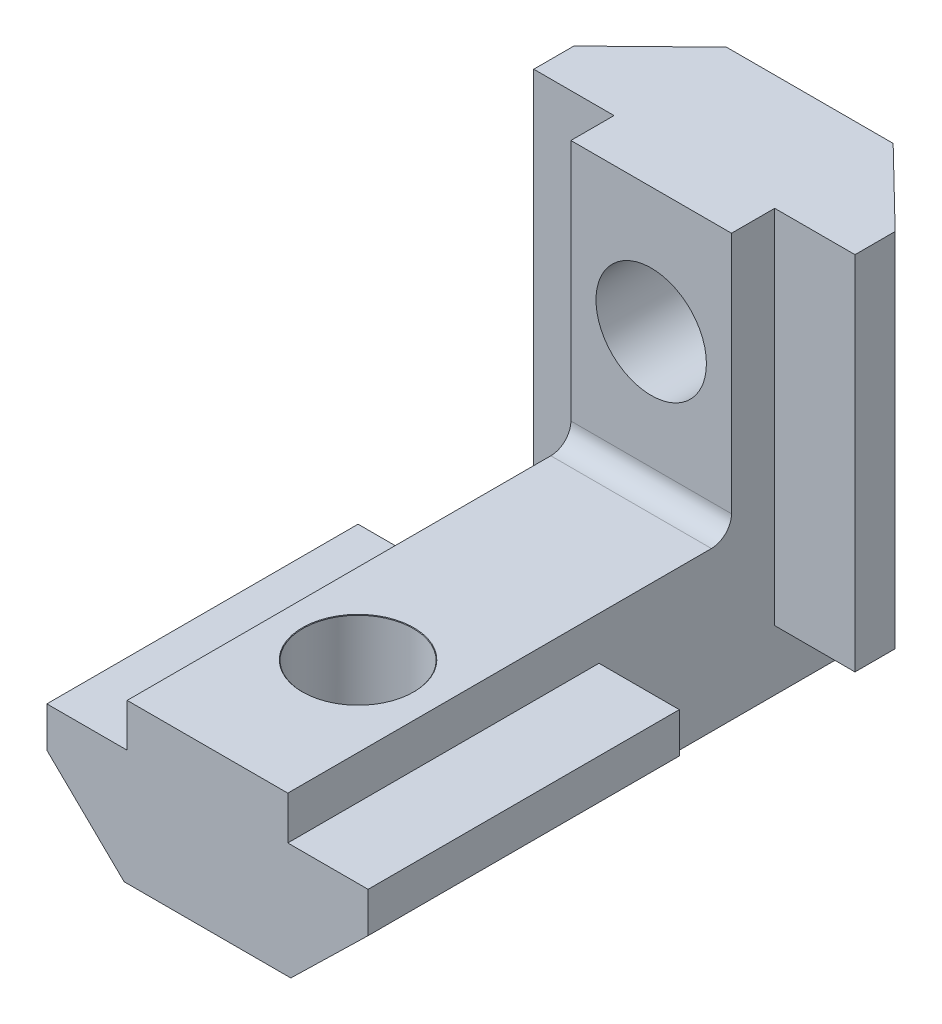
ISO-10303-21;
HEADER;
FILE_DESCRIPTION(('STEP AP214'),'2;1');
FILE_NAME('part.step','',(''),(''),'','','');
FILE_SCHEMA(('AUTOMOTIVE_DESIGN { 1 0 10303 214 1 1 1 1 }'));
ENDSEC;
DATA;
#1=APPLICATION_CONTEXT('core data for automotive mechanical design processes');
#2=APPLICATION_PROTOCOL_DEFINITION('international standard','automotive_design',2000,#1);
#3=PRODUCT_CONTEXT('',#1,'mechanical');
#4=PRODUCT('Part','Part','',(#3));
#5=PRODUCT_RELATED_PRODUCT_CATEGORY('part','',(#4));
#6=PRODUCT_DEFINITION_FORMATION('','',#4);
#7=PRODUCT_DEFINITION_CONTEXT('part definition',#1,'design');
#8=PRODUCT_DEFINITION('design','',#6,#7);
#9=PRODUCT_DEFINITION_SHAPE('','',#8);
#10=(LENGTH_UNIT() NAMED_UNIT(*) SI_UNIT(.MILLI.,.METRE.));
#11=(NAMED_UNIT(*) PLANE_ANGLE_UNIT() SI_UNIT($,.RADIAN.));
#12=(NAMED_UNIT(*) SI_UNIT($,.STERADIAN.) SOLID_ANGLE_UNIT());
#13=UNCERTAINTY_MEASURE_WITH_UNIT(LENGTH_MEASURE(1.E-05),#10,'distance_accuracy_value','');
#14=(GEOMETRIC_REPRESENTATION_CONTEXT(3) GLOBAL_UNCERTAINTY_ASSIGNED_CONTEXT((#13)) GLOBAL_UNIT_ASSIGNED_CONTEXT((#10,
#11,#12)) REPRESENTATION_CONTEXT('',''));
#15=CARTESIAN_POINT('',(0.,0.,0.));
#16=DIRECTION('',(0.,0.,1.));
#17=DIRECTION('',(1.,0.,0.));
#18=AXIS2_PLACEMENT_3D('',#15,#16,#17);
#19=CARTESIAN_POINT('',(-4.,7.9,-15.5));
#20=DIRECTION('',(-1.,0.,0.));
#21=DIRECTION('',(0.,0.,1.));
#22=AXIS2_PLACEMENT_3D('',#19,#20,#21);
#23=PLANE('',#22);
#24=DIRECTION('',(0.,0.,1.));
#25=VECTOR('',#24,1.);
#26=CARTESIAN_POINT('',(-4.,7.9,-15.5));
#27=LINE('',#26,#25);
#28=CARTESIAN_POINT('',(-4.,7.9,-21.1));
#29=VERTEX_POINT('',#28);
#30=CARTESIAN_POINT('',(-4.,7.9,0.));
#31=VERTEX_POINT('',#30);
#32=EDGE_CURVE('E306',#29,#31,#27,.T.);
#33=ORIENTED_EDGE('',*,*,#32,.F.);
#34=CARTESIAN_POINT('',(-4.,8.9,-21.1));
#35=DIRECTION('',(-1.,0.,0.));
#36=DIRECTION('',(0.,0.,1.));
#37=AXIS2_PLACEMENT_3D('',#34,#35,#36);
#38=CIRCLE('',#37,1.);
#39=CARTESIAN_POINT('',(-4.,8.9,-22.1));
#40=VERTEX_POINT('',#39);
#41=EDGE_CURVE('E44',#29,#40,#38,.F.);
#42=ORIENTED_EDGE('',*,*,#41,.T.);
#43=DIRECTION('',(0.,1.,0.));
#44=VECTOR('',#43,1.);
#45=CARTESIAN_POINT('',(-4.,-32.8440466262561,-22.1));
#46=LINE('',#45,#44);
#47=CARTESIAN_POINT('',(-4.,21.,-22.1));
#48=VERTEX_POINT('',#47);
#49=EDGE_CURVE('E248',#40,#48,#46,.T.);
#50=ORIENTED_EDGE('',*,*,#49,.T.);
#51=DIRECTION('',(0.,0.,-1.));
#52=VECTOR('',#51,1.);
#53=CARTESIAN_POINT('',(-4.,21.,-24.25));
#54=LINE('',#53,#52);
#55=CARTESIAN_POINT('',(-4.,21.,-24.25));
#56=VERTEX_POINT('',#55);
#57=EDGE_CURVE('E250',#48,#56,#54,.T.);
#58=ORIENTED_EDGE('',*,*,#57,.T.);
#59=DIRECTION('',(0.,1.,0.));
#60=VECTOR('',#59,1.);
#61=CARTESIAN_POINT('',(-4.,-32.8440466262561,-24.25));
#62=LINE('',#61,#60);
#63=CARTESIAN_POINT('',(-4.,3.,-24.25));
#64=VERTEX_POINT('',#63);
#65=EDGE_CURVE('E251',#64,#56,#62,.T.);
#66=ORIENTED_EDGE('',*,*,#65,.F.);
#67=DIRECTION('',(0.,0.,1.));
#68=VECTOR('',#67,1.);
#69=CARTESIAN_POINT('',(-4.,3.,-15.5));
#70=LINE('',#69,#68);
#71=CARTESIAN_POINT('',(-4.,3.,-30.));
#72=VERTEX_POINT('',#71);
#73=EDGE_CURVE('E219',#72,#64,#70,.T.);
#74=ORIENTED_EDGE('',*,*,#73,.F.);
#75=DIRECTION('',(0.,1.,0.));
#76=VECTOR('',#75,1.);
#77=CARTESIAN_POINT('',(-4.,0.,-30.));
#78=LINE('',#77,#76);
#79=CARTESIAN_POINT('',(-4.,0.,-30.));
#80=VERTEX_POINT('',#79);
#81=EDGE_CURVE('E206',#80,#72,#78,.T.);
#82=ORIENTED_EDGE('',*,*,#81,.F.);
#83=DIRECTION('',(0.,0.,1.));
#84=VECTOR('',#83,1.);
#85=CARTESIAN_POINT('',(-4.,0.,-30.));
#86=LINE('',#85,#84);
#87=CARTESIAN_POINT('',(-4.,0.,-15.5));
#88=VERTEX_POINT('',#87);
#89=EDGE_CURVE('E269',#80,#88,#86,.T.);
#90=ORIENTED_EDGE('',*,*,#89,.T.);
#91=DIRECTION('',(0.,1.,0.));
#92=VECTOR('',#91,1.);
#93=CARTESIAN_POINT('',(-4.,0.,-15.5));
#94=LINE('',#93,#92);
#95=CARTESIAN_POINT('',(-4.,5.75,-15.5));
#96=VERTEX_POINT('',#95);
#97=EDGE_CURVE('E263',#88,#96,#94,.T.);
#98=ORIENTED_EDGE('',*,*,#97,.T.);
#99=DIRECTION('',(0.,0.,1.));
#100=VECTOR('',#99,1.);
#101=CARTESIAN_POINT('',(-4.,5.75,-15.5));
#102=LINE('',#101,#100);
#103=CARTESIAN_POINT('',(-4.,5.75,0.));
#104=VERTEX_POINT('',#103);
#105=EDGE_CURVE('E303',#96,#104,#102,.T.);
#106=ORIENTED_EDGE('',*,*,#105,.T.);
#107=DIRECTION('',(0.,-1.,0.));
#108=VECTOR('',#107,1.);
#109=CARTESIAN_POINT('',(-4.,7.9,0.));
#110=LINE('',#109,#108);
#111=EDGE_CURVE('E329',#31,#104,#110,.T.);
#112=ORIENTED_EDGE('',*,*,#111,.F.);
#113=EDGE_LOOP('',(#33,#42,#50,#58,#66,#74,#82,#90,#98,#106,#112));
#114=FACE_BOUND('',#113,.T.);
#115=ADVANCED_FACE('F36',(#114),#23,.T.);
#116=CARTESIAN_POINT('',(4.,7.9,-15.5));
#117=DIRECTION('',(0.,1.,0.));
#118=DIRECTION('',(0.,0.,1.));
#119=AXIS2_PLACEMENT_3D('',#116,#117,#118);
#120=PLANE('',#119);
#121=CARTESIAN_POINT('',(0.,7.9,-7.5));
#122=DIRECTION('',(0.,1.,0.));
#123=DIRECTION('',(0.,0.,1.));
#124=AXIS2_PLACEMENT_3D('',#121,#122,#123);
#125=CIRCLE('',#124,2.775);
#126=CARTESIAN_POINT('',(0.,7.9,-4.725));
#127=VERTEX_POINT('',#126);
#128=EDGE_CURVE('E492',#127,#127,#125,.T.);
#129=ORIENTED_EDGE('',*,*,#128,.F.);
#130=EDGE_LOOP('',(#129));
#131=FACE_BOUND('',#130,.T.);
#132=DIRECTION('',(0.,0.,1.));
#133=VECTOR('',#132,1.);
#134=CARTESIAN_POINT('',(4.,7.9,-15.5));
#135=LINE('',#134,#133);
#136=CARTESIAN_POINT('',(4.,7.9,-21.1));
#137=VERTEX_POINT('',#136);
#138=CARTESIAN_POINT('',(4.,7.9,0.));
#139=VERTEX_POINT('',#138);
#140=EDGE_CURVE('E292',#137,#139,#135,.T.);
#141=ORIENTED_EDGE('',*,*,#140,.F.);
#142=DIRECTION('',(-1.,0.,0.));
#143=VECTOR('',#142,1.);
#144=CARTESIAN_POINT('',(4.,7.9,-21.1));
#145=LINE('',#144,#143);
#146=EDGE_CURVE('E279',#137,#29,#145,.T.);
#147=ORIENTED_EDGE('',*,*,#146,.T.);
#148=ORIENTED_EDGE('',*,*,#32,.T.);
#149=DIRECTION('',(-1.,0.,0.));
#150=VECTOR('',#149,1.);
#151=CARTESIAN_POINT('',(4.,7.9,0.));
#152=LINE('',#151,#150);
#153=EDGE_CURVE('E373',#139,#31,#152,.T.);
#154=ORIENTED_EDGE('',*,*,#153,.F.);
#155=EDGE_LOOP('',(#141,#147,#148,#154));
#156=FACE_BOUND('',#155,.T.);
#157=ADVANCED_FACE('F323',(#131,#156),#120,.T.);
#158=CARTESIAN_POINT('',(4.,5.75,-15.5));
#159=DIRECTION('',(1.,0.,0.));
#160=DIRECTION('',(0.,0.,-1.));
#161=AXIS2_PLACEMENT_3D('',#158,#159,#160);
#162=PLANE('',#161);
#163=DIRECTION('',(0.,1.,0.));
#164=VECTOR('',#163,1.);
#165=CARTESIAN_POINT('',(4.,-32.8440466262561,-24.25));
#166=LINE('',#165,#164);
#167=CARTESIAN_POINT('',(4.,3.,-24.25));
#168=VERTEX_POINT('',#167);
#169=CARTESIAN_POINT('',(4.,21.,-24.25));
#170=VERTEX_POINT('',#169);
#171=EDGE_CURVE('E242',#168,#170,#166,.T.);
#172=ORIENTED_EDGE('',*,*,#171,.T.);
#173=DIRECTION('',(0.,0.,1.));
#174=VECTOR('',#173,1.);
#175=CARTESIAN_POINT('',(4.,21.,-22.1));
#176=LINE('',#175,#174);
#177=CARTESIAN_POINT('',(4.,21.,-22.1));
#178=VERTEX_POINT('',#177);
#179=EDGE_CURVE('E244',#170,#178,#176,.T.);
#180=ORIENTED_EDGE('',*,*,#179,.T.);
#181=DIRECTION('',(0.,1.,0.));
#182=VECTOR('',#181,1.);
#183=CARTESIAN_POINT('',(4.,-32.8440466262561,-22.1));
#184=LINE('',#183,#182);
#185=CARTESIAN_POINT('',(4.,8.9,-22.1));
#186=VERTEX_POINT('',#185);
#187=EDGE_CURVE('E245',#186,#178,#184,.T.);
#188=ORIENTED_EDGE('',*,*,#187,.F.);
#189=CARTESIAN_POINT('',(4.,8.9,-21.1));
#190=DIRECTION('',(1.,0.,0.));
#191=DIRECTION('',(0.,0.,-1.));
#192=AXIS2_PLACEMENT_3D('',#189,#190,#191);
#193=CIRCLE('',#192,1.);
#194=EDGE_CURVE('E12',#186,#137,#193,.F.);
#195=ORIENTED_EDGE('',*,*,#194,.T.);
#196=ORIENTED_EDGE('',*,*,#140,.T.);
#197=DIRECTION('',(0.,1.,0.));
#198=VECTOR('',#197,1.);
#199=CARTESIAN_POINT('',(4.,5.75,0.));
#200=LINE('',#199,#198);
#201=CARTESIAN_POINT('',(4.,5.75,0.));
#202=VERTEX_POINT('',#201);
#203=EDGE_CURVE('E370',#202,#139,#200,.T.);
#204=ORIENTED_EDGE('',*,*,#203,.F.);
#205=DIRECTION('',(0.,0.,1.));
#206=VECTOR('',#205,1.);
#207=CARTESIAN_POINT('',(4.,5.75,-15.5));
#208=LINE('',#207,#206);
#209=CARTESIAN_POINT('',(4.,5.75,-15.5));
#210=VERTEX_POINT('',#209);
#211=EDGE_CURVE('E290',#210,#202,#208,.T.);
#212=ORIENTED_EDGE('',*,*,#211,.F.);
#213=DIRECTION('',(0.,-1.,0.));
#214=VECTOR('',#213,1.);
#215=CARTESIAN_POINT('',(4.,7.9,-15.5));
#216=LINE('',#215,#214);
#217=CARTESIAN_POINT('',(4.,0.,-15.5));
#218=VERTEX_POINT('',#217);
#219=EDGE_CURVE('E275',#210,#218,#216,.T.);
#220=ORIENTED_EDGE('',*,*,#219,.T.);
#221=DIRECTION('',(0.,0.,1.));
#222=VECTOR('',#221,1.);
#223=CARTESIAN_POINT('',(4.,0.,-30.));
#224=LINE('',#223,#222);
#225=CARTESIAN_POINT('',(4.,0.,-30.));
#226=VERTEX_POINT('',#225);
#227=EDGE_CURVE('E284',#226,#218,#224,.T.);
#228=ORIENTED_EDGE('',*,*,#227,.F.);
#229=DIRECTION('',(0.,-1.,0.));
#230=VECTOR('',#229,1.);
#231=CARTESIAN_POINT('',(4.,7.9,-30.));
#232=LINE('',#231,#230);
#233=CARTESIAN_POINT('',(4.,3.,-30.));
#234=VERTEX_POINT('',#233);
#235=EDGE_CURVE('E264',#234,#226,#232,.T.);
#236=ORIENTED_EDGE('',*,*,#235,.F.);
#237=DIRECTION('',(0.,0.,-1.));
#238=VECTOR('',#237,1.);
#239=CARTESIAN_POINT('',(4.,3.,-15.5));
#240=LINE('',#239,#238);
#241=EDGE_CURVE('E216',#168,#234,#240,.T.);
#242=ORIENTED_EDGE('',*,*,#241,.F.);
#243=EDGE_LOOP('',(#172,#180,#188,#195,#196,#204,#212,#220,#228,#236,#242));
#244=FACE_BOUND('',#243,.T.);
#245=ADVANCED_FACE('F409',(#244),#162,.T.);
#246=CARTESIAN_POINT('',(0.,0.,-15.5));
#247=DIRECTION('',(0.,0.,-1.));
#248=DIRECTION('',(-1.,0.,0.));
#249=AXIS2_PLACEMENT_3D('',#246,#247,#248);
#250=PLANE('',#249);
#251=ORIENTED_EDGE('',*,*,#97,.F.);
#252=DIRECTION('',(1.,0.,0.));
#253=VECTOR('',#252,1.);
#254=CARTESIAN_POINT('',(-4.15,0.,-15.5));
#255=LINE('',#254,#253);
#256=CARTESIAN_POINT('',(-4.15,0.,-15.5));
#257=VERTEX_POINT('',#256);
#258=EDGE_CURVE('E342',#257,#88,#255,.T.);
#259=ORIENTED_EDGE('',*,*,#258,.F.);
#260=DIRECTION('',(0.7163488096607,-0.697742347072111,0.));
#261=VECTOR('',#260,1.);
#262=CARTESIAN_POINT('',(-4.15,0.,-15.5));
#263=LINE('',#262,#261);
#264=CARTESIAN_POINT('',(-8.,3.75,-15.5));
#265=VERTEX_POINT('',#264);
#266=EDGE_CURVE('E348',#265,#257,#263,.T.);
#267=ORIENTED_EDGE('',*,*,#266,.F.);
#268=DIRECTION('',(0.,-1.,0.));
#269=VECTOR('',#268,1.);
#270=CARTESIAN_POINT('',(-8.,3.75,-15.5));
#271=LINE('',#270,#269);
#272=CARTESIAN_POINT('',(-8.,5.75,-15.5));
#273=VERTEX_POINT('',#272);
#274=EDGE_CURVE('E311',#273,#265,#271,.T.);
#275=ORIENTED_EDGE('',*,*,#274,.F.);
#276=DIRECTION('',(-1.,0.,0.));
#277=VECTOR('',#276,1.);
#278=CARTESIAN_POINT('',(-4.,5.75,-15.5));
#279=LINE('',#278,#277);
#280=EDGE_CURVE('E299',#96,#273,#279,.T.);
#281=ORIENTED_EDGE('',*,*,#280,.F.);
#282=EDGE_LOOP('',(#251,#259,#267,#275,#281));
#283=FACE_BOUND('',#282,.T.);
#284=ADVANCED_FACE('F401',(#283),#250,.T.);
#285=CARTESIAN_POINT('',(-4.15,0.,-15.5));
#286=DIRECTION('',(-0.697742347072111,-0.7163488096607,0.));
#287=DIRECTION('',(0.7163488096607,-0.697742347072111,0.));
#288=AXIS2_PLACEMENT_3D('',#285,#286,#287);
#289=PLANE('',#288);
#290=DIRECTION('',(0.7163488096607,-0.697742347072111,0.));
#291=VECTOR('',#290,1.);
#292=CARTESIAN_POINT('',(-4.15,0.,0.));
#293=LINE('',#292,#291);
#294=CARTESIAN_POINT('',(-8.,3.75,0.));
#295=VERTEX_POINT('',#294);
#296=CARTESIAN_POINT('',(-4.15,0.,0.));
#297=VERTEX_POINT('',#296);
#298=EDGE_CURVE('E287',#295,#297,#293,.T.);
#299=ORIENTED_EDGE('',*,*,#298,.F.);
#300=DIRECTION('',(0.,0.,1.));
#301=VECTOR('',#300,1.);
#302=CARTESIAN_POINT('',(-8.,3.75,-15.5));
#303=LINE('',#302,#301);
#304=EDGE_CURVE('E280',#265,#295,#303,.T.);
#305=ORIENTED_EDGE('',*,*,#304,.F.);
#306=ORIENTED_EDGE('',*,*,#266,.T.);
#307=DIRECTION('',(0.,0.,1.));
#308=VECTOR('',#307,1.);
#309=CARTESIAN_POINT('',(-4.15,0.,-15.5));
#310=LINE('',#309,#308);
#311=EDGE_CURVE('E341',#257,#297,#310,.T.);
#312=ORIENTED_EDGE('',*,*,#311,.T.);
#313=EDGE_LOOP('',(#299,#305,#306,#312));
#314=FACE_BOUND('',#313,.T.);
#315=ADVANCED_FACE('F393',(#314),#289,.T.);
#316=CARTESIAN_POINT('',(-8.,3.75,-15.5));
#317=DIRECTION('',(-1.,0.,0.));
#318=DIRECTION('',(0.,0.,1.));
#319=AXIS2_PLACEMENT_3D('',#316,#317,#318);
#320=PLANE('',#319);
#321=DIRECTION('',(0.,-1.,0.));
#322=VECTOR('',#321,1.);
#323=CARTESIAN_POINT('',(-8.,3.75,0.));
#324=LINE('',#323,#322);
#325=CARTESIAN_POINT('',(-8.,5.75,0.));
#326=VERTEX_POINT('',#325);
#327=EDGE_CURVE('E379',#326,#295,#324,.T.);
#328=ORIENTED_EDGE('',*,*,#327,.F.);
#329=DIRECTION('',(0.,0.,1.));
#330=VECTOR('',#329,1.);
#331=CARTESIAN_POINT('',(-8.,5.75,-15.5));
#332=LINE('',#331,#330);
#333=EDGE_CURVE('E305',#273,#326,#332,.T.);
#334=ORIENTED_EDGE('',*,*,#333,.F.);
#335=ORIENTED_EDGE('',*,*,#274,.T.);
#336=ORIENTED_EDGE('',*,*,#304,.T.);
#337=EDGE_LOOP('',(#328,#334,#335,#336));
#338=FACE_BOUND('',#337,.T.);
#339=ADVANCED_FACE('F391',(#338),#320,.T.);
#340=CARTESIAN_POINT('',(-4.,5.75,-15.5));
#341=DIRECTION('',(0.,1.,0.));
#342=DIRECTION('',(0.,0.,1.));
#343=AXIS2_PLACEMENT_3D('',#340,#341,#342);
#344=PLANE('',#343);
#345=DIRECTION('',(-1.,0.,0.));
#346=VECTOR('',#345,1.);
#347=CARTESIAN_POINT('',(-4.,5.75,0.));
#348=LINE('',#347,#346);
#349=EDGE_CURVE('E376',#104,#326,#348,.T.);
#350=ORIENTED_EDGE('',*,*,#349,.F.);
#351=ORIENTED_EDGE('',*,*,#105,.F.);
#352=ORIENTED_EDGE('',*,*,#280,.T.);
#353=ORIENTED_EDGE('',*,*,#333,.T.);
#354=EDGE_LOOP('',(#350,#351,#352,#353));
#355=FACE_BOUND('',#354,.T.);
#356=ADVANCED_FACE('F386',(#355),#344,.T.);
#357=CARTESIAN_POINT('',(8.,5.75,-15.5));
#358=DIRECTION('',(0.,1.,0.));
#359=DIRECTION('',(0.,0.,1.));
#360=AXIS2_PLACEMENT_3D('',#357,#358,#359);
#361=PLANE('',#360);
#362=DIRECTION('',(-1.,0.,0.));
#363=VECTOR('',#362,1.);
#364=CARTESIAN_POINT('',(8.,5.75,0.));
#365=LINE('',#364,#363);
#366=CARTESIAN_POINT('',(8.,5.75,0.));
#367=VERTEX_POINT('',#366);
#368=EDGE_CURVE('E367',#367,#202,#365,.T.);
#369=ORIENTED_EDGE('',*,*,#368,.F.);
#370=DIRECTION('',(0.,0.,1.));
#371=VECTOR('',#370,1.);
#372=CARTESIAN_POINT('',(8.,5.75,-15.5));
#373=LINE('',#372,#371);
#374=CARTESIAN_POINT('',(8.,5.75,-15.5));
#375=VERTEX_POINT('',#374);
#376=EDGE_CURVE('E293',#375,#367,#373,.T.);
#377=ORIENTED_EDGE('',*,*,#376,.F.);
#378=DIRECTION('',(-1.,0.,0.));
#379=VECTOR('',#378,1.);
#380=CARTESIAN_POINT('',(8.,5.75,-15.5));
#381=LINE('',#380,#379);
#382=EDGE_CURVE('E296',#375,#210,#381,.T.);
#383=ORIENTED_EDGE('',*,*,#382,.T.);
#384=ORIENTED_EDGE('',*,*,#211,.T.);
#385=EDGE_LOOP('',(#369,#377,#383,#384));
#386=FACE_BOUND('',#385,.T.);
#387=ADVANCED_FACE('F399',(#386),#361,.T.);
#388=CARTESIAN_POINT('',(8.,3.75,-15.5));
#389=DIRECTION('',(1.,0.,0.));
#390=DIRECTION('',(0.,0.,-1.));
#391=AXIS2_PLACEMENT_3D('',#388,#389,#390);
#392=PLANE('',#391);
#393=DIRECTION('',(0.,1.,0.));
#394=VECTOR('',#393,1.);
#395=CARTESIAN_POINT('',(8.,3.75,0.));
#396=LINE('',#395,#394);
#397=CARTESIAN_POINT('',(8.,3.75,0.));
#398=VERTEX_POINT('',#397);
#399=EDGE_CURVE('E364',#398,#367,#396,.T.);
#400=ORIENTED_EDGE('',*,*,#399,.F.);
#401=DIRECTION('',(0.,0.,1.));
#402=VECTOR('',#401,1.);
#403=CARTESIAN_POINT('',(8.,3.75,-15.5));
#404=LINE('',#403,#402);
#405=CARTESIAN_POINT('',(8.,3.75,-15.5));
#406=VERTEX_POINT('',#405);
#407=EDGE_CURVE('E337',#406,#398,#404,.T.);
#408=ORIENTED_EDGE('',*,*,#407,.F.);
#409=DIRECTION('',(0.,1.,0.));
#410=VECTOR('',#409,1.);
#411=CARTESIAN_POINT('',(8.,3.75,-15.5));
#412=LINE('',#411,#410);
#413=EDGE_CURVE('E300',#406,#375,#412,.T.);
#414=ORIENTED_EDGE('',*,*,#413,.T.);
#415=ORIENTED_EDGE('',*,*,#376,.T.);
#416=EDGE_LOOP('',(#400,#408,#414,#415));
#417=FACE_BOUND('',#416,.T.);
#418=ADVANCED_FACE('F418',(#417),#392,.T.);
#419=CARTESIAN_POINT('',(4.15,0.,-15.5));
#420=DIRECTION('',(0.697742347072111,-0.7163488096607,0.));
#421=DIRECTION('',(0.7163488096607,0.697742347072111,0.));
#422=AXIS2_PLACEMENT_3D('',#419,#420,#421);
#423=PLANE('',#422);
#424=DIRECTION('',(0.7163488096607,0.697742347072111,0.));
#425=VECTOR('',#424,1.);
#426=CARTESIAN_POINT('',(4.15,0.,0.));
#427=LINE('',#426,#425);
#428=CARTESIAN_POINT('',(4.15,0.,0.));
#429=VERTEX_POINT('',#428);
#430=EDGE_CURVE('E361',#429,#398,#427,.T.);
#431=ORIENTED_EDGE('',*,*,#430,.F.);
#432=DIRECTION('',(0.,0.,1.));
#433=VECTOR('',#432,1.);
#434=CARTESIAN_POINT('',(4.15,0.,-15.5));
#435=LINE('',#434,#433);
#436=CARTESIAN_POINT('',(4.15,0.,-15.5));
#437=VERTEX_POINT('',#436);
#438=EDGE_CURVE('E339',#437,#429,#435,.T.);
#439=ORIENTED_EDGE('',*,*,#438,.F.);
#440=DIRECTION('',(0.7163488096607,0.697742347072111,0.));
#441=VECTOR('',#440,1.);
#442=CARTESIAN_POINT('',(4.15,0.,-15.5));
#443=LINE('',#442,#441);
#444=EDGE_CURVE('E344',#437,#406,#443,.T.);
#445=ORIENTED_EDGE('',*,*,#444,.T.);
#446=ORIENTED_EDGE('',*,*,#407,.T.);
#447=EDGE_LOOP('',(#431,#439,#445,#446));
#448=FACE_BOUND('',#447,.T.);
#449=ADVANCED_FACE('F422',(#448),#423,.T.);
#450=CARTESIAN_POINT('',(-4.15,0.,-15.5));
#451=DIRECTION('',(0.,-1.,0.));
#452=DIRECTION('',(0.,0.,-1.));
#453=AXIS2_PLACEMENT_3D('',#450,#451,#452);
#454=PLANE('',#453);
#455=CARTESIAN_POINT('',(0.,0.,-7.5));
#456=DIRECTION('',(0.,-1.,0.));
#457=DIRECTION('',(0.,0.,-1.));
#458=AXIS2_PLACEMENT_3D('',#455,#456,#457);
#459=CIRCLE('',#458,2.75);
#460=CARTESIAN_POINT('',(0.,0.,-10.25));
#461=VERTEX_POINT('',#460);
#462=EDGE_CURVE('E260',#461,#461,#459,.T.);
#463=ORIENTED_EDGE('',*,*,#462,.F.);
#464=EDGE_LOOP('',(#463));
#465=FACE_BOUND('',#464,.T.);
#466=DIRECTION('',(1.,0.,0.));
#467=VECTOR('',#466,1.);
#468=CARTESIAN_POINT('',(-4.15,0.,0.));
#469=LINE('',#468,#467);
#470=EDGE_CURVE('E358',#297,#429,#469,.T.);
#471=ORIENTED_EDGE('',*,*,#470,.F.);
#472=ORIENTED_EDGE('',*,*,#311,.F.);
#473=ORIENTED_EDGE('',*,*,#258,.T.);
#474=ORIENTED_EDGE('',*,*,#89,.F.);
#475=DIRECTION('',(-1.,0.,0.));
#476=VECTOR('',#475,1.);
#477=CARTESIAN_POINT('',(4.,0.,-30.));
#478=LINE('',#477,#476);
#479=EDGE_CURVE('E266',#226,#80,#478,.T.);
#480=ORIENTED_EDGE('',*,*,#479,.F.);
#481=ORIENTED_EDGE('',*,*,#227,.T.);
#482=EDGE_CURVE('E281',#218,#437,#255,.T.);
#483=ORIENTED_EDGE('',*,*,#482,.T.);
#484=ORIENTED_EDGE('',*,*,#438,.T.);
#485=EDGE_LOOP('',(#471,#472,#473,#474,#480,#481,#483,#484));
#486=FACE_BOUND('',#485,.T.);
#487=ADVANCED_FACE('F426',(#465,#486),#454,.T.);
#488=ORIENTED_EDGE('',*,*,#219,.F.);
#489=ORIENTED_EDGE('',*,*,#382,.F.);
#490=ORIENTED_EDGE('',*,*,#413,.F.);
#491=ORIENTED_EDGE('',*,*,#444,.F.);
#492=ORIENTED_EDGE('',*,*,#482,.F.);
#493=EDGE_LOOP('',(#488,#489,#490,#491,#492));
#494=FACE_BOUND('',#493,.T.);
#495=ADVANCED_FACE('F429',(#494),#250,.T.);
#496=CARTESIAN_POINT('',(0.,0.,0.));
#497=DIRECTION('',(0.,0.,-1.));
#498=DIRECTION('',(-1.,0.,0.));
#499=AXIS2_PLACEMENT_3D('',#496,#497,#498);
#500=PLANE('',#499);
#501=ORIENTED_EDGE('',*,*,#298,.T.);
#502=ORIENTED_EDGE('',*,*,#470,.T.);
#503=ORIENTED_EDGE('',*,*,#430,.T.);
#504=ORIENTED_EDGE('',*,*,#399,.T.);
#505=ORIENTED_EDGE('',*,*,#368,.T.);
#506=ORIENTED_EDGE('',*,*,#203,.T.);
#507=ORIENTED_EDGE('',*,*,#153,.T.);
#508=ORIENTED_EDGE('',*,*,#111,.T.);
#509=ORIENTED_EDGE('',*,*,#349,.T.);
#510=ORIENTED_EDGE('',*,*,#327,.T.);
#511=EDGE_LOOP('',(#501,#502,#503,#504,#505,#506,#507,#508,#509,#510));
#512=FACE_BOUND('',#511,.T.);
#513=ADVANCED_FACE('F390',(#512),#500,.F.);
#514=CARTESIAN_POINT('',(0.,0.,-30.));
#515=DIRECTION('',(0.,0.,-1.));
#516=DIRECTION('',(-1.,0.,0.));
#517=AXIS2_PLACEMENT_3D('',#514,#515,#516);
#518=PLANE('',#517);
#519=CARTESIAN_POINT('',(0.,14.75,-30.));
#520=DIRECTION('',(0.,0.,-1.));
#521=DIRECTION('',(-1.,0.,0.));
#522=AXIS2_PLACEMENT_3D('',#519,#520,#521);
#523=CIRCLE('',#522,2.75);
#524=CARTESIAN_POINT('',(-2.75,14.75,-30.));
#525=VERTEX_POINT('',#524);
#526=EDGE_CURVE('E490',#525,#525,#523,.T.);
#527=ORIENTED_EDGE('',*,*,#526,.F.);
#528=EDGE_LOOP('',(#527));
#529=FACE_BOUND('',#528,.T.);
#530=ORIENTED_EDGE('',*,*,#81,.T.);
#531=DIRECTION('',(1.,0.,0.));
#532=VECTOR('',#531,1.);
#533=CARTESIAN_POINT('',(4.15,3.,-30.));
#534=LINE('',#533,#532);
#535=CARTESIAN_POINT('',(-4.15,3.,-30.));
#536=VERTEX_POINT('',#535);
#537=EDGE_CURVE('E203',#536,#72,#534,.T.);
#538=ORIENTED_EDGE('',*,*,#537,.F.);
#539=DIRECTION('',(0.,1.,0.));
#540=VECTOR('',#539,1.);
#541=CARTESIAN_POINT('',(-4.15,-32.8440466262561,-30.));
#542=LINE('',#541,#540);
#543=CARTESIAN_POINT('',(-4.15,21.,-30.));
#544=VERTEX_POINT('',#543);
#545=EDGE_CURVE('E188',#536,#544,#542,.T.);
#546=ORIENTED_EDGE('',*,*,#545,.T.);
#547=DIRECTION('',(1.,0.,0.));
#548=VECTOR('',#547,1.);
#549=CARTESIAN_POINT('',(4.15,21.,-30.));
#550=LINE('',#549,#548);
#551=CARTESIAN_POINT('',(4.15,21.,-30.));
#552=VERTEX_POINT('',#551);
#553=EDGE_CURVE('E199',#544,#552,#550,.T.);
#554=ORIENTED_EDGE('',*,*,#553,.T.);
#555=DIRECTION('',(0.,1.,0.));
#556=VECTOR('',#555,1.);
#557=CARTESIAN_POINT('',(4.15,-32.8440466262561,-30.));
#558=LINE('',#557,#556);
#559=CARTESIAN_POINT('',(4.15,3.,-30.));
#560=VERTEX_POINT('',#559);
#561=EDGE_CURVE('E259',#560,#552,#558,.T.);
#562=ORIENTED_EDGE('',*,*,#561,.F.);
#563=EDGE_CURVE('E210',#234,#560,#534,.T.);
#564=ORIENTED_EDGE('',*,*,#563,.F.);
#565=ORIENTED_EDGE('',*,*,#235,.T.);
#566=ORIENTED_EDGE('',*,*,#479,.T.);
#567=EDGE_LOOP('',(#530,#538,#546,#554,#562,#564,#565,#566));
#568=FACE_BOUND('',#567,.T.);
#569=ADVANCED_FACE('F204',(#529,#568),#518,.T.);
#570=CARTESIAN_POINT('',(0.,3.,0.));
#571=DIRECTION('',(0.,-1.,0.));
#572=DIRECTION('',(0.,0.,-1.));
#573=AXIS2_PLACEMENT_3D('',#570,#571,#572);
#574=PLANE('',#573);
#575=ORIENTED_EDGE('',*,*,#537,.T.);
#576=ORIENTED_EDGE('',*,*,#73,.T.);
#577=DIRECTION('',(-1.,0.,0.));
#578=VECTOR('',#577,1.);
#579=CARTESIAN_POINT('',(-8.,3.,-24.25));
#580=LINE('',#579,#578);
#581=CARTESIAN_POINT('',(-8.,3.,-24.25));
#582=VERTEX_POINT('',#581);
#583=EDGE_CURVE('E221',#64,#582,#580,.T.);
#584=ORIENTED_EDGE('',*,*,#583,.T.);
#585=DIRECTION('',(0.,0.,-1.));
#586=VECTOR('',#585,1.);
#587=CARTESIAN_POINT('',(-8.,3.,-24.25));
#588=LINE('',#587,#586);
#589=CARTESIAN_POINT('',(-8.,3.,-26.25));
#590=VERTEX_POINT('',#589);
#591=EDGE_CURVE('E215',#582,#590,#588,.T.);
#592=ORIENTED_EDGE('',*,*,#591,.T.);
#593=DIRECTION('',(0.7163488096607,0.,-0.697742347072111));
#594=VECTOR('',#593,1.);
#595=CARTESIAN_POINT('',(-4.15,3.,-30.));
#596=LINE('',#595,#594);
#597=EDGE_CURVE('E192',#590,#536,#596,.T.);
#598=ORIENTED_EDGE('',*,*,#597,.T.);
#599=EDGE_LOOP('',(#575,#576,#584,#592,#598));
#600=FACE_BOUND('',#599,.T.);
#601=ADVANCED_FACE('F213',(#600),#574,.T.);
#602=CARTESIAN_POINT('',(4.15,-32.8440466262561,-30.));
#603=DIRECTION('',(-0.697742347072111,0.,0.7163488096607));
#604=DIRECTION('',(0.7163488096607,0.,0.697742347072111));
#605=AXIS2_PLACEMENT_3D('',#602,#603,#604);
#606=PLANE('',#605);
#607=DIRECTION('',(0.7163488096607,0.,0.697742347072111));
#608=VECTOR('',#607,1.);
#609=CARTESIAN_POINT('',(4.15,3.,-30.));
#610=LINE('',#609,#608);
#611=CARTESIAN_POINT('',(8.,3.,-26.25));
#612=VERTEX_POINT('',#611);
#613=EDGE_CURVE('E209',#560,#612,#610,.T.);
#614=ORIENTED_EDGE('',*,*,#613,.F.);
#615=ORIENTED_EDGE('',*,*,#561,.T.);
#616=DIRECTION('',(0.7163488096607,0.,0.697742347072111));
#617=VECTOR('',#616,1.);
#618=CARTESIAN_POINT('',(4.15,21.,-30.));
#619=LINE('',#618,#617);
#620=CARTESIAN_POINT('',(8.,21.,-26.25));
#621=VERTEX_POINT('',#620);
#622=EDGE_CURVE('E224',#552,#621,#619,.T.);
#623=ORIENTED_EDGE('',*,*,#622,.T.);
#624=DIRECTION('',(0.,1.,0.));
#625=VECTOR('',#624,1.);
#626=CARTESIAN_POINT('',(8.,-32.8440466262561,-26.25));
#627=LINE('',#626,#625);
#628=EDGE_CURVE('E236',#612,#621,#627,.T.);
#629=ORIENTED_EDGE('',*,*,#628,.F.);
#630=EDGE_LOOP('',(#614,#615,#623,#629));
#631=FACE_BOUND('',#630,.T.);
#632=ADVANCED_FACE('F477',(#631),#606,.F.);
#633=CARTESIAN_POINT('',(8.,-32.8440466262561,-24.25));
#634=DIRECTION('',(-1.,0.,0.));
#635=DIRECTION('',(0.,0.,1.));
#636=AXIS2_PLACEMENT_3D('',#633,#634,#635);
#637=PLANE('',#636);
#638=DIRECTION('',(0.,0.,1.));
#639=VECTOR('',#638,1.);
#640=CARTESIAN_POINT('',(8.,3.,-24.25));
#641=LINE('',#640,#639);
#642=CARTESIAN_POINT('',(8.,3.,-24.25));
#643=VERTEX_POINT('',#642);
#644=EDGE_CURVE('E231',#612,#643,#641,.T.);
#645=ORIENTED_EDGE('',*,*,#644,.F.);
#646=ORIENTED_EDGE('',*,*,#628,.T.);
#647=DIRECTION('',(0.,0.,1.));
#648=VECTOR('',#647,1.);
#649=CARTESIAN_POINT('',(8.,21.,-24.25));
#650=LINE('',#649,#648);
#651=CARTESIAN_POINT('',(8.,21.,-24.25));
#652=VERTEX_POINT('',#651);
#653=EDGE_CURVE('E238',#621,#652,#650,.T.);
#654=ORIENTED_EDGE('',*,*,#653,.T.);
#655=DIRECTION('',(0.,1.,0.));
#656=VECTOR('',#655,1.);
#657=CARTESIAN_POINT('',(8.,-32.8440466262561,-24.25));
#658=LINE('',#657,#656);
#659=EDGE_CURVE('E239',#643,#652,#658,.T.);
#660=ORIENTED_EDGE('',*,*,#659,.F.);
#661=EDGE_LOOP('',(#645,#646,#654,#660));
#662=FACE_BOUND('',#661,.T.);
#663=ADVANCED_FACE('F482',(#662),#637,.F.);
#664=CARTESIAN_POINT('',(4.,-32.8440466262561,-24.25));
#665=DIRECTION('',(0.,0.,-1.));
#666=DIRECTION('',(-1.,0.,0.));
#667=AXIS2_PLACEMENT_3D('',#664,#665,#666);
#668=PLANE('',#667);
#669=DIRECTION('',(-1.,0.,0.));
#670=VECTOR('',#669,1.);
#671=CARTESIAN_POINT('',(4.,3.,-24.25));
#672=LINE('',#671,#670);
#673=EDGE_CURVE('E228',#643,#168,#672,.T.);
#674=ORIENTED_EDGE('',*,*,#673,.F.);
#675=ORIENTED_EDGE('',*,*,#659,.T.);
#676=DIRECTION('',(-1.,0.,0.));
#677=VECTOR('',#676,1.);
#678=CARTESIAN_POINT('',(4.,21.,-24.25));
#679=LINE('',#678,#677);
#680=EDGE_CURVE('E241',#652,#170,#679,.T.);
#681=ORIENTED_EDGE('',*,*,#680,.T.);
#682=ORIENTED_EDGE('',*,*,#171,.F.);
#683=EDGE_LOOP('',(#674,#675,#681,#682));
#684=FACE_BOUND('',#683,.T.);
#685=ADVANCED_FACE('F528',(#684),#668,.F.);
#686=CARTESIAN_POINT('',(-4.,-32.8440466262561,-22.1));
#687=DIRECTION('',(0.,0.,-1.));
#688=DIRECTION('',(-1.,0.,0.));
#689=AXIS2_PLACEMENT_3D('',#686,#687,#688);
#690=PLANE('',#689);
#691=CARTESIAN_POINT('',(0.,14.75,-22.1));
#692=DIRECTION('',(0.,0.,1.));
#693=DIRECTION('',(1.,0.,0.));
#694=AXIS2_PLACEMENT_3D('',#691,#692,#693);
#695=CIRCLE('',#694,2.75);
#696=CARTESIAN_POINT('',(2.75,14.75,-22.1));
#697=VERTEX_POINT('',#696);
#698=EDGE_CURVE('E493',#697,#697,#695,.T.);
#699=ORIENTED_EDGE('',*,*,#698,.F.);
#700=EDGE_LOOP('',(#699));
#701=FACE_BOUND('',#700,.T.);
#702=ORIENTED_EDGE('',*,*,#49,.F.);
#703=DIRECTION('',(-1.,0.,0.));
#704=VECTOR('',#703,1.);
#705=CARTESIAN_POINT('',(-4.,8.9,-22.1));
#706=LINE('',#705,#704);
#707=EDGE_CURVE('E57',#40,#186,#706,.F.);
#708=ORIENTED_EDGE('',*,*,#707,.T.);
#709=ORIENTED_EDGE('',*,*,#187,.T.);
#710=DIRECTION('',(-1.,0.,0.));
#711=VECTOR('',#710,1.);
#712=CARTESIAN_POINT('',(-4.,21.,-22.1));
#713=LINE('',#712,#711);
#714=EDGE_CURVE('E247',#178,#48,#713,.T.);
#715=ORIENTED_EDGE('',*,*,#714,.T.);
#716=EDGE_LOOP('',(#702,#708,#709,#715));
#717=FACE_BOUND('',#716,.T.);
#718=ADVANCED_FACE('F543',(#701,#717),#690,.F.);
#719=CARTESIAN_POINT('',(-8.,-32.8440466262561,-24.25));
#720=DIRECTION('',(0.,0.,-1.));
#721=DIRECTION('',(-1.,0.,0.));
#722=AXIS2_PLACEMENT_3D('',#719,#720,#721);
#723=PLANE('',#722);
#724=ORIENTED_EDGE('',*,*,#583,.F.);
#725=ORIENTED_EDGE('',*,*,#65,.T.);
#726=DIRECTION('',(-1.,0.,0.));
#727=VECTOR('',#726,1.);
#728=CARTESIAN_POINT('',(-8.,21.,-24.25));
#729=LINE('',#728,#727);
#730=CARTESIAN_POINT('',(-8.,21.,-24.25));
#731=VERTEX_POINT('',#730);
#732=EDGE_CURVE('E253',#56,#731,#729,.T.);
#733=ORIENTED_EDGE('',*,*,#732,.T.);
#734=DIRECTION('',(0.,1.,0.));
#735=VECTOR('',#734,1.);
#736=CARTESIAN_POINT('',(-8.,-32.8440466262561,-24.25));
#737=LINE('',#736,#735);
#738=EDGE_CURVE('E254',#582,#731,#737,.T.);
#739=ORIENTED_EDGE('',*,*,#738,.F.);
#740=EDGE_LOOP('',(#724,#725,#733,#739));
#741=FACE_BOUND('',#740,.T.);
#742=ADVANCED_FACE('F538',(#741),#723,.F.);
#743=CARTESIAN_POINT('',(-8.,-32.8440466262561,-24.25));
#744=DIRECTION('',(1.,0.,0.));
#745=DIRECTION('',(0.,0.,-1.));
#746=AXIS2_PLACEMENT_3D('',#743,#744,#745);
#747=PLANE('',#746);
#748=ORIENTED_EDGE('',*,*,#591,.F.);
#749=ORIENTED_EDGE('',*,*,#738,.T.);
#750=DIRECTION('',(0.,0.,-1.));
#751=VECTOR('',#750,1.);
#752=CARTESIAN_POINT('',(-8.,21.,-24.25));
#753=LINE('',#752,#751);
#754=CARTESIAN_POINT('',(-8.,21.,-26.25));
#755=VERTEX_POINT('',#754);
#756=EDGE_CURVE('E256',#731,#755,#753,.T.);
#757=ORIENTED_EDGE('',*,*,#756,.T.);
#758=DIRECTION('',(0.,1.,0.));
#759=VECTOR('',#758,1.);
#760=CARTESIAN_POINT('',(-8.,-32.8440466262561,-26.25));
#761=LINE('',#760,#759);
#762=EDGE_CURVE('E257',#590,#755,#761,.T.);
#763=ORIENTED_EDGE('',*,*,#762,.F.);
#764=EDGE_LOOP('',(#748,#749,#757,#763));
#765=FACE_BOUND('',#764,.T.);
#766=ADVANCED_FACE('F541',(#765),#747,.F.);
#767=CARTESIAN_POINT('',(-4.15,-32.8440466262561,-30.));
#768=DIRECTION('',(0.697742347072111,0.,0.7163488096607));
#769=DIRECTION('',(0.7163488096607,0.,-0.697742347072111));
#770=AXIS2_PLACEMENT_3D('',#767,#768,#769);
#771=PLANE('',#770);
#772=ORIENTED_EDGE('',*,*,#597,.F.);
#773=ORIENTED_EDGE('',*,*,#762,.T.);
#774=DIRECTION('',(0.7163488096607,0.,-0.697742347072111));
#775=VECTOR('',#774,1.);
#776=CARTESIAN_POINT('',(-4.15,21.,-30.));
#777=LINE('',#776,#775);
#778=EDGE_CURVE('E195',#755,#544,#777,.T.);
#779=ORIENTED_EDGE('',*,*,#778,.T.);
#780=ORIENTED_EDGE('',*,*,#545,.F.);
#781=EDGE_LOOP('',(#772,#773,#779,#780));
#782=FACE_BOUND('',#781,.T.);
#783=ADVANCED_FACE('F190',(#782),#771,.F.);
#784=CARTESIAN_POINT('',(0.,21.,0.));
#785=DIRECTION('',(0.,-1.,0.));
#786=DIRECTION('',(0.,0.,-1.));
#787=AXIS2_PLACEMENT_3D('',#784,#785,#786);
#788=PLANE('',#787);
#789=ORIENTED_EDGE('',*,*,#622,.F.);
#790=ORIENTED_EDGE('',*,*,#553,.F.);
#791=ORIENTED_EDGE('',*,*,#778,.F.);
#792=ORIENTED_EDGE('',*,*,#756,.F.);
#793=ORIENTED_EDGE('',*,*,#732,.F.);
#794=ORIENTED_EDGE('',*,*,#57,.F.);
#795=ORIENTED_EDGE('',*,*,#714,.F.);
#796=ORIENTED_EDGE('',*,*,#179,.F.);
#797=ORIENTED_EDGE('',*,*,#680,.F.);
#798=ORIENTED_EDGE('',*,*,#653,.F.);
#799=EDGE_LOOP('',(#789,#790,#791,#792,#793,#794,#795,#796,#797,#798));
#800=FACE_BOUND('',#799,.T.);
#801=ADVANCED_FACE('F466',(#800),#788,.F.);
#802=ORIENTED_EDGE('',*,*,#673,.T.);
#803=ORIENTED_EDGE('',*,*,#241,.T.);
#804=ORIENTED_EDGE('',*,*,#563,.T.);
#805=ORIENTED_EDGE('',*,*,#613,.T.);
#806=ORIENTED_EDGE('',*,*,#644,.T.);
#807=EDGE_LOOP('',(#802,#803,#804,#805,#806));
#808=FACE_BOUND('',#807,.T.);
#809=ADVANCED_FACE('F458',(#808),#574,.T.);
#810=CARTESIAN_POINT('',(4.,8.9,-21.1));
#811=DIRECTION('',(-1.,0.,0.));
#812=DIRECTION('',(0.,0.,1.));
#813=AXIS2_PLACEMENT_3D('',#810,#811,#812);
#814=CYLINDRICAL_SURFACE('',#813,1.);
#815=ORIENTED_EDGE('',*,*,#194,.F.);
#816=ORIENTED_EDGE('',*,*,#707,.F.);
#817=ORIENTED_EDGE('',*,*,#41,.F.);
#818=ORIENTED_EDGE('',*,*,#146,.F.);
#819=EDGE_LOOP('',(#815,#816,#817,#818));
#820=FACE_BOUND('',#819,.T.);
#821=ADVANCED_FACE('F38',(#820),#814,.F.);
#822=CARTESIAN_POINT('',(0.,7.9,-7.5));
#823=DIRECTION('',(0.,1.,0.));
#824=DIRECTION('',(0.,0.,1.));
#825=AXIS2_PLACEMENT_3D('',#822,#823,#824);
#826=CYLINDRICAL_SURFACE('',#825,2.75);
#827=CARTESIAN_POINT('',(0.,7.875,-7.5));
#828=DIRECTION('',(0.,1.,0.));
#829=DIRECTION('',(0.,0.,1.));
#830=AXIS2_PLACEMENT_3D('',#827,#828,#829);
#831=CIRCLE('',#830,2.75);
#832=CARTESIAN_POINT('',(0.,7.875,-4.75));
#833=VERTEX_POINT('',#832);
#834=EDGE_CURVE('E496',#833,#833,#831,.T.);
#835=ORIENTED_EDGE('',*,*,#834,.T.);
#836=EDGE_LOOP('',(#835));
#837=FACE_BOUND('',#836,.T.);
#838=ORIENTED_EDGE('',*,*,#462,.T.);
#839=EDGE_LOOP('',(#838));
#840=FACE_BOUND('',#839,.T.);
#841=ADVANCED_FACE('F457',(#837,#840),#826,.F.);
#842=CARTESIAN_POINT('',(0.,7.9,-7.5));
#843=DIRECTION('',(0.,1.,0.));
#844=DIRECTION('',(0.,0.,1.));
#845=AXIS2_PLACEMENT_3D('',#842,#843,#844);
#846=CONICAL_SURFACE('',#845,2.775,0.785398163397448);
#847=ORIENTED_EDGE('',*,*,#834,.F.);
#848=EDGE_LOOP('',(#847));
#849=FACE_BOUND('',#848,.T.);
#850=ORIENTED_EDGE('',*,*,#128,.T.);
#851=EDGE_LOOP('',(#850));
#852=FACE_BOUND('',#851,.T.);
#853=ADVANCED_FACE('F463',(#849,#852),#846,.F.);
#854=CARTESIAN_POINT('',(0.,14.75,-22.1));
#855=DIRECTION('',(0.,0.,1.));
#856=DIRECTION('',(1.,0.,0.));
#857=AXIS2_PLACEMENT_3D('',#854,#855,#856);
#858=CYLINDRICAL_SURFACE('',#857,2.75);
#859=ORIENTED_EDGE('',*,*,#526,.T.);
#860=EDGE_LOOP('',(#859));
#861=FACE_BOUND('',#860,.T.);
#862=ORIENTED_EDGE('',*,*,#698,.T.);
#863=EDGE_LOOP('',(#862));
#864=FACE_BOUND('',#863,.T.);
#865=ADVANCED_FACE('F644',(#861,#864),#858,.F.);
#866=CLOSED_SHELL('',(#115,#157,#245,#284,#315,#339,#356,#387,#418,#449,#487,#495,#513,#569,
#601,#632,#663,#685,#718,#742,#766,#783,#801,#809,#821,#841,#853,#865));
#867=MANIFOLD_SOLID_BREP('B2',#866);
#868=ADVANCED_BREP_SHAPE_REPRESENTATION('',(#18,#867),#14);
#869=SHAPE_DEFINITION_REPRESENTATION(#9,#868);
ENDSEC;
END-ISO-10303-21;
